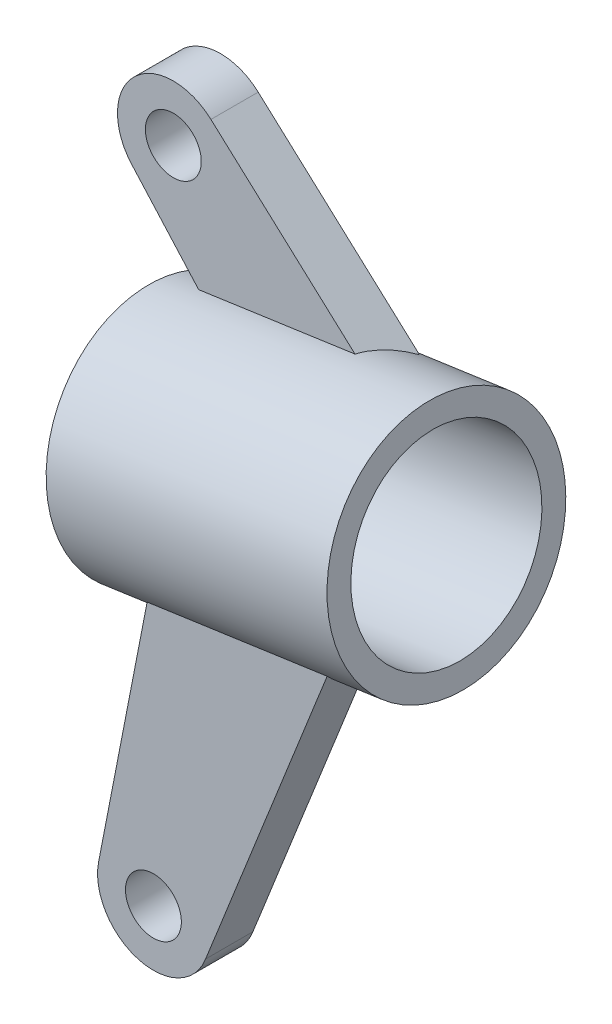
ISO-10303-21;
HEADER;
FILE_DESCRIPTION(('STEP AP214'),'2;1');
FILE_NAME('part.step','',(''),(''),'','','');
FILE_SCHEMA(('AUTOMOTIVE_DESIGN { 1 0 10303 214 1 1 1 1 }'));
ENDSEC;
DATA;
#1=APPLICATION_CONTEXT('core data for automotive mechanical design processes');
#2=APPLICATION_PROTOCOL_DEFINITION('international standard','automotive_design',2000,#1);
#3=PRODUCT_CONTEXT('',#1,'mechanical');
#4=PRODUCT('Part','Part','',(#3));
#5=PRODUCT_RELATED_PRODUCT_CATEGORY('part','',(#4));
#6=PRODUCT_DEFINITION_FORMATION('','',#4);
#7=PRODUCT_DEFINITION_CONTEXT('part definition',#1,'design');
#8=PRODUCT_DEFINITION('design','',#6,#7);
#9=PRODUCT_DEFINITION_SHAPE('','',#8);
#10=(LENGTH_UNIT() NAMED_UNIT(*) SI_UNIT(.MILLI.,.METRE.));
#11=(NAMED_UNIT(*) PLANE_ANGLE_UNIT() SI_UNIT($,.RADIAN.));
#12=(NAMED_UNIT(*) SI_UNIT($,.STERADIAN.) SOLID_ANGLE_UNIT());
#13=UNCERTAINTY_MEASURE_WITH_UNIT(LENGTH_MEASURE(1.E-05),#10,'distance_accuracy_value','');
#14=(GEOMETRIC_REPRESENTATION_CONTEXT(3) GLOBAL_UNCERTAINTY_ASSIGNED_CONTEXT((#13)) GLOBAL_UNIT_ASSIGNED_CONTEXT((#10,
#11,#12)) REPRESENTATION_CONTEXT('',''));
#15=CARTESIAN_POINT('',(0.,0.,0.));
#16=DIRECTION('',(0.,0.,1.));
#17=DIRECTION('',(1.,0.,0.));
#18=AXIS2_PLACEMENT_3D('',#15,#16,#17);
#19=CARTESIAN_POINT('',(83.7600521849239,35.3779335228185,0.));
#20=DIRECTION('',(-0.989921655743304,-0.141616084857745,0.));
#21=DIRECTION('',(0.141616084857745,-0.989921655743304,0.));
#22=AXIS2_PLACEMENT_3D('',#19,#20,#21);
#23=CYLINDRICAL_SURFACE('',#22,6.34999999999999);
#24=CARTESIAN_POINT('',(99.0387593594898,37.5636728479425,0.));
#25=DIRECTION('',(0.673198597584902,0.739461728698464,0.));
#26=DIRECTION('',(-0.739461728698464,0.673198597584902,0.));
#27=AXIS2_PLACEMENT_3D('',#24,#25,#26);
#28=ELLIPSE('',#27,8.23463074433766,6.34999999999999);
#29=CARTESIAN_POINT('',(93.0143964180359,43.0481929064282,-0.924149545205112));
#30=VERTEX_POINT('',#29);
#31=CARTESIAN_POINT('',(93.9354798847363,42.2096476863358,-3.46414954520511));
#32=VERTEX_POINT('',#31);
#33=EDGE_CURVE('E205',#30,#32,#28,.F.);
#34=ORIENTED_EDGE('',*,*,#33,.F.);
#35=DIRECTION('',(-0.989921655743304,-0.141616084857745,0.));
#36=VECTOR('',#35,1.);
#37=CARTESIAN_POINT('',(82.8703644446413,41.5970092855736,-0.924149545205112));
#38=LINE('',#37,#36);
#39=CARTESIAN_POINT('',(84.6168629891443,41.8468596496376,-0.924149545205112));
#40=VERTEX_POINT('',#39);
#41=EDGE_CURVE('E209',#30,#40,#38,.T.);
#42=ORIENTED_EDGE('',*,*,#41,.T.);
#43=CARTESIAN_POINT('',(89.6420004107362,36.2193925152981,0.));
#44=DIRECTION('',(0.745897281645723,0.666060992127238,0.));
#45=DIRECTION('',(-0.666060992127238,0.745897281645723,0.));
#46=AXIS2_PLACEMENT_3D('',#43,#44,#45);
#47=ELLIPSE('',#46,7.62575144505944,6.34999999999999);
#48=CARTESIAN_POINT('',(85.3851717782905,40.9864588093806,-3.46414954520511));
#49=VERTEX_POINT('',#48);
#50=EDGE_CURVE('E126',#40,#49,#47,.F.);
#51=ORIENTED_EDGE('',*,*,#50,.T.);
#52=DIRECTION('',(-0.989921655743304,-0.141616084857745,0.));
#53=VECTOR('',#52,1.);
#54=CARTESIAN_POINT('',(83.0063915525802,40.6461555739199,-3.46414954520511));
#55=LINE('',#54,#53);
#56=EDGE_CURVE('E238',#32,#49,#55,.T.);
#57=ORIENTED_EDGE('',*,*,#56,.F.);
#58=EDGE_LOOP('',(#34,#42,#51,#57));
#59=FACE_BOUND('',#58,.T.);
#60=CARTESIAN_POINT('',(98.8464582184518,37.5361626560505,0.));
#61=DIRECTION('',(-0.989921655743304,-0.141616084857745,0.));
#62=DIRECTION('',(0.141616084857745,-0.989921655743304,0.));
#63=AXIS2_PLACEMENT_3D('',#60,#61,#62);
#64=CIRCLE('',#63,6.35);
#65=CARTESIAN_POINT('',(99.7457203572985,31.2501601420806,0.));
#66=VERTEX_POINT('',#65);
#67=EDGE_CURVE('E202',#66,#66,#64,.T.);
#68=ORIENTED_EDGE('',*,*,#67,.T.);
#69=EDGE_LOOP('',(#68));
#70=FACE_BOUND('',#69,.T.);
#71=CARTESIAN_POINT('',(83.7600521849239,35.3779335228185,0.));
#72=DIRECTION('',(-0.989921655743304,-0.141616084857745,0.));
#73=DIRECTION('',(0.141616084857745,-0.989921655743304,0.));
#74=AXIS2_PLACEMENT_3D('',#71,#72,#73);
#75=CIRCLE('',#74,6.34999999999999);
#76=CARTESIAN_POINT('',(84.6593143237706,29.0919310088485,0.));
#77=VERTEX_POINT('',#76);
#78=EDGE_CURVE('E183',#77,#77,#75,.T.);
#79=ORIENTED_EDGE('',*,*,#78,.F.);
#80=EDGE_LOOP('',(#79));
#81=FACE_BOUND('',#80,.T.);
#82=DIRECTION('',(-0.989921655743304,-0.141616084857745,0.));
#83=VECTOR('',#82,1.);
#84=CARTESIAN_POINT('',(84.393811468689,30.9478432533574,4.50501380404853));
#85=LINE('',#84,#83);
#86=CARTESIAN_POINT('',(96.9456112982433,32.7434770183799,4.50501380404853));
#87=VERTEX_POINT('',#86);
#88=CARTESIAN_POINT('',(87.2781109911031,31.3604650033227,4.50501380404853));
#89=VERTEX_POINT('',#88);
#90=EDGE_CURVE('E12',#87,#89,#85,.T.);
#91=ORIENTED_EDGE('',*,*,#90,.F.);
#92=CARTESIAN_POINT('',(98.8514244566357,37.5368731155137,0.));
#93=DIRECTION('',(-0.929246467114131,0.369460421907281,0.));
#94=DIRECTION('',(-0.369460421907281,-0.929246467114131,0.));
#95=AXIS2_PLACEMENT_3D('',#92,#93,#94);
#96=ELLIPSE('',#95,7.31938133116411,6.34999999999999);
#97=CARTESIAN_POINT('',(96.2799384042587,31.0692132858926,1.96501380404853));
#98=VERTEX_POINT('',#97);
#99=EDGE_CURVE('E244',#98,#87,#96,.T.);
#100=ORIENTED_EDGE('',*,*,#99,.F.);
#101=DIRECTION('',(-0.989921655743304,-0.141616084857745,0.));
#102=VECTOR('',#101,1.);
#103=CARTESIAN_POINT('',(84.6151743943545,29.4004769770261,1.96501380404853));
#104=LINE('',#103,#102);
#105=CARTESIAN_POINT('',(86.9618484685332,29.736187174792,1.96501380404853));
#106=VERTEX_POINT('',#105);
#107=EDGE_CURVE('E241',#98,#106,#104,.T.);
#108=ORIENTED_EDGE('',*,*,#107,.T.);
#109=CARTESIAN_POINT('',(88.1835666322546,36.0107520834674,0.));
#110=DIRECTION('',(0.981566589582526,-0.191120459960021,0.));
#111=DIRECTION('',(-0.191120459960021,-0.981566589582526,0.));
#112=AXIS2_PLACEMENT_3D('',#109,#110,#111);
#113=ELLIPSE('',#112,6.72236317606064,6.34999999999999);
#114=EDGE_CURVE('E111',#89,#106,#113,.T.);
#115=ORIENTED_EDGE('',*,*,#114,.F.);
#116=EDGE_LOOP('',(#91,#100,#108,#115));
#117=FACE_BOUND('',#116,.T.);
#118=ADVANCED_FACE('F103',(#59,#70,#81,#117),#23,.T.);
#119=CARTESIAN_POINT('',(97.9471960796051,43.8221651700205,0.));
#120=DIRECTION('',(0.989921655743304,0.141616084857745,0.));
#121=DIRECTION('',(-0.141616084857745,0.989921655743304,0.));
#122=AXIS2_PLACEMENT_3D('',#119,#120,#121);
#123=PLANE('',#122);
#124=CARTESIAN_POINT('',(98.8464582184519,37.5361626560503,0.));
#125=DIRECTION('',(0.989921655743304,0.141616084857745,0.));
#126=DIRECTION('',(-0.141616084857745,0.989921655743304,0.));
#127=AXIS2_PLACEMENT_3D('',#124,#125,#126);
#128=CIRCLE('',#127,5.08);
#129=CARTESIAN_POINT('',(98.1270485073746,42.5649646672263,0.));
#130=VERTEX_POINT('',#129);
#131=EDGE_CURVE('E402',#130,#130,#128,.T.);
#132=ORIENTED_EDGE('',*,*,#131,.F.);
#133=EDGE_LOOP('',(#132));
#134=FACE_BOUND('',#133,.T.);
#135=ORIENTED_EDGE('',*,*,#67,.F.);
#136=EDGE_LOOP('',(#135));
#137=FACE_BOUND('',#136,.T.);
#138=ADVANCED_FACE('F264',(#134,#137),#123,.T.);
#139=CARTESIAN_POINT('',(82.8607900460772,41.6639360367885,0.));
#140=DIRECTION('',(0.989921655743304,0.141616084857745,0.));
#141=DIRECTION('',(-0.141616084857745,0.989921655743304,0.));
#142=AXIS2_PLACEMENT_3D('',#139,#140,#141);
#143=PLANE('',#142);
#144=CARTESIAN_POINT('',(83.7600521849239,35.3779335228183,0.));
#145=DIRECTION('',(0.989921655743304,0.141616084857745,0.));
#146=DIRECTION('',(-0.141616084857745,0.989921655743304,0.));
#147=AXIS2_PLACEMENT_3D('',#144,#145,#146);
#148=CIRCLE('',#147,5.08);
#149=CARTESIAN_POINT('',(83.0406424738466,40.4067355339943,0.));
#150=VERTEX_POINT('',#149);
#151=EDGE_CURVE('E399',#150,#150,#148,.F.);
#152=ORIENTED_EDGE('',*,*,#151,.F.);
#153=EDGE_LOOP('',(#152));
#154=FACE_BOUND('',#153,.T.);
#155=ORIENTED_EDGE('',*,*,#78,.T.);
#156=EDGE_LOOP('',(#155));
#157=FACE_BOUND('',#156,.T.);
#158=ADVANCED_FACE('F271',(#154,#157),#143,.F.);
#159=CARTESIAN_POINT('',(83.2550330493172,47.8760150838199,-0.924149545205112));
#160=DIRECTION('',(0.,0.,-1.));
#161=DIRECTION('',(-1.,0.,0.));
#162=AXIS2_PLACEMENT_3D('',#159,#160,#161);
#163=PLANE('',#162);
#164=CARTESIAN_POINT('',(83.2550330493172,47.8760150838199,-0.924149545205112));
#165=DIRECTION('',(0.,0.,-1.));
#166=DIRECTION('',(-1.,0.,0.));
#167=AXIS2_PLACEMENT_3D('',#164,#165,#166);
#168=CIRCLE('',#167,1.5);
#169=CARTESIAN_POINT('',(81.7550330493172,47.8760150838199,-0.924149545205112));
#170=VERTEX_POINT('',#169);
#171=EDGE_CURVE('E212',#170,#170,#168,.T.);
#172=ORIENTED_EDGE('',*,*,#171,.T.);
#173=EDGE_LOOP('',(#172));
#174=FACE_BOUND('',#173,.T.);
#175=ORIENTED_EDGE('',*,*,#41,.F.);
#176=DIRECTION('',(0.739461728698464,-0.673198597584902,0.));
#177=VECTOR('',#176,1.);
#178=CARTESIAN_POINT('',(85.2746288420719,50.0944002699153,-0.924149545205112));
#179=LINE('',#178,#177);
#180=CARTESIAN_POINT('',(85.2746288420719,50.0944002699153,-0.924149545205112));
#181=VERTEX_POINT('',#180);
#182=EDGE_CURVE('E221',#181,#30,#179,.T.);
#183=ORIENTED_EDGE('',*,*,#182,.F.);
#184=CARTESIAN_POINT('',(83.2550330493172,47.8760150838199,-0.924149545205112));
#185=DIRECTION('',(0.,0.,-1.));
#186=DIRECTION('',(-1.,0.,0.));
#187=AXIS2_PLACEMENT_3D('',#184,#185,#186);
#188=CIRCLE('',#187,3.00000000000002);
#189=CARTESIAN_POINT('',(81.01734120438,45.8778321074382,-0.924149545205112));
#190=VERTEX_POINT('',#189);
#191=EDGE_CURVE('E218',#190,#181,#188,.T.);
#192=ORIENTED_EDGE('',*,*,#191,.F.);
#193=DIRECTION('',(0.666060992127238,-0.745897281645723,0.));
#194=VECTOR('',#193,1.);
#195=CARTESIAN_POINT('',(81.01734120438,45.8778321074382,-0.924149545205112));
#196=LINE('',#195,#194);
#197=EDGE_CURVE('E225',#190,#40,#196,.T.);
#198=ORIENTED_EDGE('',*,*,#197,.T.);
#199=EDGE_LOOP('',(#175,#183,#192,#198));
#200=FACE_BOUND('',#199,.T.);
#201=ADVANCED_FACE('F282',(#174,#200),#163,.F.);
#202=CARTESIAN_POINT('',(83.2550330493172,47.8760150838199,-3.46414954520511));
#203=DIRECTION('',(0.,0.,-1.));
#204=DIRECTION('',(-1.,0.,0.));
#205=AXIS2_PLACEMENT_3D('',#202,#203,#204);
#206=PLANE('',#205);
#207=CARTESIAN_POINT('',(83.2550330493172,47.8760150838199,-3.46414954520511));
#208=DIRECTION('',(0.,0.,-1.));
#209=DIRECTION('',(-1.,0.,0.));
#210=AXIS2_PLACEMENT_3D('',#207,#208,#209);
#211=CIRCLE('',#210,1.5);
#212=CARTESIAN_POINT('',(81.7550330493172,47.8760150838199,-3.46414954520511));
#213=VERTEX_POINT('',#212);
#214=EDGE_CURVE('E211',#213,#213,#211,.T.);
#215=ORIENTED_EDGE('',*,*,#214,.F.);
#216=EDGE_LOOP('',(#215));
#217=FACE_BOUND('',#216,.T.);
#218=DIRECTION('',(0.739461728698464,-0.673198597584902,0.));
#219=VECTOR('',#218,1.);
#220=CARTESIAN_POINT('',(85.2746288420719,50.0944002699153,-3.46414954520511));
#221=LINE('',#220,#219);
#222=CARTESIAN_POINT('',(85.2746288420719,50.0944002699153,-3.46414954520511));
#223=VERTEX_POINT('',#222);
#224=EDGE_CURVE('E231',#223,#32,#221,.T.);
#225=ORIENTED_EDGE('',*,*,#224,.T.);
#226=ORIENTED_EDGE('',*,*,#56,.T.);
#227=DIRECTION('',(0.666060992127238,-0.745897281645723,0.));
#228=VECTOR('',#227,1.);
#229=CARTESIAN_POINT('',(81.01734120438,45.8778321074382,-3.46414954520511));
#230=LINE('',#229,#228);
#231=CARTESIAN_POINT('',(81.01734120438,45.8778321074382,-3.46414954520511));
#232=VERTEX_POINT('',#231);
#233=EDGE_CURVE('E222',#232,#49,#230,.T.);
#234=ORIENTED_EDGE('',*,*,#233,.F.);
#235=CARTESIAN_POINT('',(83.2550330493172,47.8760150838199,-3.46414954520511));
#236=DIRECTION('',(0.,0.,-1.));
#237=DIRECTION('',(-1.,0.,0.));
#238=AXIS2_PLACEMENT_3D('',#235,#236,#237);
#239=CIRCLE('',#238,3.00000000000002);
#240=EDGE_CURVE('E215',#232,#223,#239,.T.);
#241=ORIENTED_EDGE('',*,*,#240,.T.);
#242=EDGE_LOOP('',(#225,#226,#234,#241));
#243=FACE_BOUND('',#242,.T.);
#244=ADVANCED_FACE('F284',(#217,#243),#206,.T.);
#245=CARTESIAN_POINT('',(83.2550330493172,47.8760150838199,-0.924149545205112));
#246=DIRECTION('',(0.,0.,-1.));
#247=DIRECTION('',(-1.,0.,0.));
#248=AXIS2_PLACEMENT_3D('',#245,#246,#247);
#249=CYLINDRICAL_SURFACE('',#248,3.00000000000002);
#250=ORIENTED_EDGE('',*,*,#240,.F.);
#251=DIRECTION('',(0.,0.,-1.));
#252=VECTOR('',#251,1.);
#253=CARTESIAN_POINT('',(81.01734120438,45.8778321074382,-0.924149545205112));
#254=LINE('',#253,#252);
#255=EDGE_CURVE('E236',#190,#232,#254,.T.);
#256=ORIENTED_EDGE('',*,*,#255,.F.);
#257=ORIENTED_EDGE('',*,*,#191,.T.);
#258=DIRECTION('',(0.,0.,-1.));
#259=VECTOR('',#258,1.);
#260=CARTESIAN_POINT('',(85.2746288420719,50.0944002699153,-0.924149545205112));
#261=LINE('',#260,#259);
#262=EDGE_CURVE('E228',#181,#223,#261,.T.);
#263=ORIENTED_EDGE('',*,*,#262,.T.);
#264=EDGE_LOOP('',(#250,#256,#257,#263));
#265=FACE_BOUND('',#264,.T.);
#266=ADVANCED_FACE('F105',(#265),#249,.T.);
#267=CARTESIAN_POINT('',(81.01734120438,45.8778321074382,-0.924149545205112));
#268=DIRECTION('',(0.745897281645723,0.666060992127238,0.));
#269=DIRECTION('',(-0.666060992127238,0.745897281645723,0.));
#270=AXIS2_PLACEMENT_3D('',#267,#268,#269);
#271=PLANE('',#270);
#272=ORIENTED_EDGE('',*,*,#50,.F.);
#273=ORIENTED_EDGE('',*,*,#197,.F.);
#274=ORIENTED_EDGE('',*,*,#255,.T.);
#275=ORIENTED_EDGE('',*,*,#233,.T.);
#276=EDGE_LOOP('',(#272,#273,#274,#275));
#277=FACE_BOUND('',#276,.T.);
#278=ADVANCED_FACE('F289',(#277),#271,.F.);
#279=CARTESIAN_POINT('',(85.2746288420719,50.0944002699153,-0.924149545205112));
#280=DIRECTION('',(0.673198597584902,0.739461728698464,0.));
#281=DIRECTION('',(-0.739461728698464,0.673198597584902,0.));
#282=AXIS2_PLACEMENT_3D('',#279,#280,#281);
#283=PLANE('',#282);
#284=ORIENTED_EDGE('',*,*,#182,.T.);
#285=ORIENTED_EDGE('',*,*,#33,.T.);
#286=ORIENTED_EDGE('',*,*,#224,.F.);
#287=ORIENTED_EDGE('',*,*,#262,.F.);
#288=EDGE_LOOP('',(#284,#285,#286,#287));
#289=FACE_BOUND('',#288,.T.);
#290=ADVANCED_FACE('F280',(#289),#283,.T.);
#291=CARTESIAN_POINT('',(83.2550330493172,47.8760150838199,-0.924149545205112));
#292=DIRECTION('',(0.,0.,-1.));
#293=DIRECTION('',(-1.,0.,0.));
#294=AXIS2_PLACEMENT_3D('',#291,#292,#293);
#295=CYLINDRICAL_SURFACE('',#294,1.5);
#296=ORIENTED_EDGE('',*,*,#171,.F.);
#297=EDGE_LOOP('',(#296));
#298=FACE_BOUND('',#297,.T.);
#299=ORIENTED_EDGE('',*,*,#214,.T.);
#300=EDGE_LOOP('',(#299));
#301=FACE_BOUND('',#300,.T.);
#302=ADVANCED_FACE('F278',(#298,#301),#295,.F.);
#303=CARTESIAN_POINT('',(87.6154369675677,17.3960150838199,4.50501380404853));
#304=DIRECTION('',(0.,0.,-1.));
#305=DIRECTION('',(-1.,0.,0.));
#306=AXIS2_PLACEMENT_3D('',#303,#304,#305);
#307=PLANE('',#306);
#308=CARTESIAN_POINT('',(87.6154369675677,17.3960150838199,4.50501380404853));
#309=DIRECTION('',(0.,0.,-1.));
#310=DIRECTION('',(-1.,0.,0.));
#311=AXIS2_PLACEMENT_3D('',#308,#309,#310);
#312=CIRCLE('',#311,1.5);
#313=CARTESIAN_POINT('',(86.1154369675677,17.3960150838199,4.50501380404853));
#314=VERTEX_POINT('',#313);
#315=EDGE_CURVE('E195',#314,#314,#312,.T.);
#316=ORIENTED_EDGE('',*,*,#315,.T.);
#317=EDGE_LOOP('',(#316));
#318=FACE_BOUND('',#317,.T.);
#319=DIRECTION('',(0.369460421907281,0.929246467114131,0.));
#320=VECTOR('',#319,1.);
#321=CARTESIAN_POINT('',(90.417203725832,16.3235865163687,4.50501380404853));
#322=LINE('',#321,#320);
#323=CARTESIAN_POINT('',(90.417203725832,16.3235865163687,4.50501380404853));
#324=VERTEX_POINT('',#323);
#325=EDGE_CURVE('E188',#324,#87,#322,.T.);
#326=ORIENTED_EDGE('',*,*,#325,.T.);
#327=ORIENTED_EDGE('',*,*,#90,.T.);
#328=DIRECTION('',(-0.191120459960021,-0.981566589582526,0.));
#329=VECTOR('',#328,1.);
#330=CARTESIAN_POINT('',(87.8155824330952,34.1208393265354,4.50501380404853));
#331=LINE('',#330,#329);
#332=CARTESIAN_POINT('',(84.6707371988201,17.9693764636999,4.50501380404853));
#333=VERTEX_POINT('',#332);
#334=EDGE_CURVE('E167',#89,#333,#331,.T.);
#335=ORIENTED_EDGE('',*,*,#334,.T.);
#336=CARTESIAN_POINT('',(87.6154369675677,17.3960150838199,4.50501380404853));
#337=DIRECTION('',(0.,0.,-1.));
#338=DIRECTION('',(-1.,0.,0.));
#339=AXIS2_PLACEMENT_3D('',#336,#337,#338);
#340=CIRCLE('',#339,3.00000000000001);
#341=EDGE_CURVE('E172',#324,#333,#340,.T.);
#342=ORIENTED_EDGE('',*,*,#341,.F.);
#343=EDGE_LOOP('',(#326,#327,#335,#342));
#344=FACE_BOUND('',#343,.T.);
#345=ADVANCED_FACE('F170',(#318,#344),#307,.F.);
#346=CARTESIAN_POINT('',(87.6154369675677,17.3960150838199,1.96501380404853));
#347=DIRECTION('',(0.,0.,-1.));
#348=DIRECTION('',(-1.,0.,0.));
#349=AXIS2_PLACEMENT_3D('',#346,#347,#348);
#350=PLANE('',#349);
#351=CARTESIAN_POINT('',(87.6154369675677,17.3960150838199,1.96501380404853));
#352=DIRECTION('',(0.,0.,-1.));
#353=DIRECTION('',(-1.,0.,0.));
#354=AXIS2_PLACEMENT_3D('',#351,#352,#353);
#355=CIRCLE('',#354,1.5);
#356=CARTESIAN_POINT('',(86.1154369675677,17.3960150838199,1.96501380404853));
#357=VERTEX_POINT('',#356);
#358=EDGE_CURVE('E404',#357,#357,#355,.T.);
#359=ORIENTED_EDGE('',*,*,#358,.F.);
#360=EDGE_LOOP('',(#359));
#361=FACE_BOUND('',#360,.T.);
#362=ORIENTED_EDGE('',*,*,#107,.F.);
#363=DIRECTION('',(0.369460421907281,0.929246467114131,0.));
#364=VECTOR('',#363,1.);
#365=CARTESIAN_POINT('',(90.417203725832,16.3235865163687,1.96501380404853));
#366=LINE('',#365,#364);
#367=CARTESIAN_POINT('',(90.417203725832,16.3235865163687,1.96501380404853));
#368=VERTEX_POINT('',#367);
#369=EDGE_CURVE('E176',#368,#98,#366,.T.);
#370=ORIENTED_EDGE('',*,*,#369,.F.);
#371=CARTESIAN_POINT('',(87.6154369675677,17.3960150838199,1.96501380404853));
#372=DIRECTION('',(0.,0.,-1.));
#373=DIRECTION('',(-1.,0.,0.));
#374=AXIS2_PLACEMENT_3D('',#371,#372,#373);
#375=CIRCLE('',#374,3.00000000000001);
#376=CARTESIAN_POINT('',(84.6707371988201,17.9693764636999,1.96501380404853));
#377=VERTEX_POINT('',#376);
#378=EDGE_CURVE('E194',#368,#377,#375,.T.);
#379=ORIENTED_EDGE('',*,*,#378,.T.);
#380=DIRECTION('',(-0.191120459960021,-0.981566589582526,0.));
#381=VECTOR('',#380,1.);
#382=CARTESIAN_POINT('',(87.8155824330952,34.1208393265354,1.96501380404853));
#383=LINE('',#382,#381);
#384=EDGE_CURVE('E118',#106,#377,#383,.T.);
#385=ORIENTED_EDGE('',*,*,#384,.F.);
#386=EDGE_LOOP('',(#362,#370,#379,#385));
#387=FACE_BOUND('',#386,.T.);
#388=ADVANCED_FACE('F248',(#361,#387),#350,.T.);
#389=CARTESIAN_POINT('',(87.8155824330952,34.1208393265354,4.50501380404853));
#390=DIRECTION('',(0.981566589582526,-0.191120459960021,0.));
#391=DIRECTION('',(0.191120459960021,0.981566589582526,0.));
#392=AXIS2_PLACEMENT_3D('',#389,#390,#391);
#393=PLANE('',#392);
#394=ORIENTED_EDGE('',*,*,#334,.F.);
#395=ORIENTED_EDGE('',*,*,#114,.T.);
#396=ORIENTED_EDGE('',*,*,#384,.T.);
#397=DIRECTION('',(0.,0.,-1.));
#398=VECTOR('',#397,1.);
#399=CARTESIAN_POINT('',(84.6707371988201,17.9693764636999,4.50501380404853));
#400=LINE('',#399,#398);
#401=EDGE_CURVE('E179',#333,#377,#400,.T.);
#402=ORIENTED_EDGE('',*,*,#401,.F.);
#403=EDGE_LOOP('',(#394,#395,#396,#402));
#404=FACE_BOUND('',#403,.T.);
#405=ADVANCED_FACE('F180',(#404),#393,.F.);
#406=CARTESIAN_POINT('',(87.6154369675677,17.3960150838199,4.50501380404853));
#407=DIRECTION('',(0.,0.,-1.));
#408=DIRECTION('',(-1.,0.,0.));
#409=AXIS2_PLACEMENT_3D('',#406,#407,#408);
#410=CYLINDRICAL_SURFACE('',#409,3.00000000000001);
#411=ORIENTED_EDGE('',*,*,#378,.F.);
#412=DIRECTION('',(0.,0.,-1.));
#413=VECTOR('',#412,1.);
#414=CARTESIAN_POINT('',(90.417203725832,16.3235865163687,4.50501380404853));
#415=LINE('',#414,#413);
#416=EDGE_CURVE('E184',#324,#368,#415,.T.);
#417=ORIENTED_EDGE('',*,*,#416,.F.);
#418=ORIENTED_EDGE('',*,*,#341,.T.);
#419=ORIENTED_EDGE('',*,*,#401,.T.);
#420=EDGE_LOOP('',(#411,#417,#418,#419));
#421=FACE_BOUND('',#420,.T.);
#422=ADVANCED_FACE('F186',(#421),#410,.T.);
#423=CARTESIAN_POINT('',(90.417203725832,16.3235865163687,4.50501380404853));
#424=DIRECTION('',(-0.929246467114131,0.369460421907281,0.));
#425=DIRECTION('',(-0.369460421907281,-0.929246467114131,0.));
#426=AXIS2_PLACEMENT_3D('',#423,#424,#425);
#427=PLANE('',#426);
#428=ORIENTED_EDGE('',*,*,#369,.T.);
#429=ORIENTED_EDGE('',*,*,#99,.T.);
#430=ORIENTED_EDGE('',*,*,#325,.F.);
#431=ORIENTED_EDGE('',*,*,#416,.T.);
#432=EDGE_LOOP('',(#428,#429,#430,#431));
#433=FACE_BOUND('',#432,.T.);
#434=ADVANCED_FACE('F250',(#433),#427,.F.);
#435=CARTESIAN_POINT('',(87.6154369675677,17.3960150838199,4.50501380404853));
#436=DIRECTION('',(0.,0.,-1.));
#437=DIRECTION('',(-1.,0.,0.));
#438=AXIS2_PLACEMENT_3D('',#435,#436,#437);
#439=CYLINDRICAL_SURFACE('',#438,1.5);
#440=ORIENTED_EDGE('',*,*,#315,.F.);
#441=EDGE_LOOP('',(#440));
#442=FACE_BOUND('',#441,.T.);
#443=ORIENTED_EDGE('',*,*,#358,.T.);
#444=EDGE_LOOP('',(#443));
#445=FACE_BOUND('',#444,.T.);
#446=ADVANCED_FACE('F252',(#442,#445),#439,.F.);
#447=CARTESIAN_POINT('',(69.5364521715355,33.3431355822013,0.));
#448=DIRECTION('',(0.989921655743304,0.141616084857745,0.));
#449=DIRECTION('',(-0.141616084857745,0.989921655743304,0.));
#450=AXIS2_PLACEMENT_3D('',#447,#448,#449);
#451=CYLINDRICAL_SURFACE('',#450,5.08);
#452=ORIENTED_EDGE('',*,*,#151,.T.);
#453=EDGE_LOOP('',(#452));
#454=FACE_BOUND('',#453,.T.);
#455=ORIENTED_EDGE('',*,*,#131,.T.);
#456=EDGE_LOOP('',(#455));
#457=FACE_BOUND('',#456,.T.);
#458=ADVANCED_FACE('F258',(#454,#457),#451,.F.);
#459=CLOSED_SHELL('',(#118,#138,#158,#201,#244,#266,#278,#290,#302,#345,#388,#405,#422,#434,
#446,#458));
#460=MANIFOLD_SOLID_BREP('B2',#459);
#461=ADVANCED_BREP_SHAPE_REPRESENTATION('',(#18,#460),#14);
#462=SHAPE_DEFINITION_REPRESENTATION(#9,#461);
ENDSEC;
END-ISO-10303-21;
